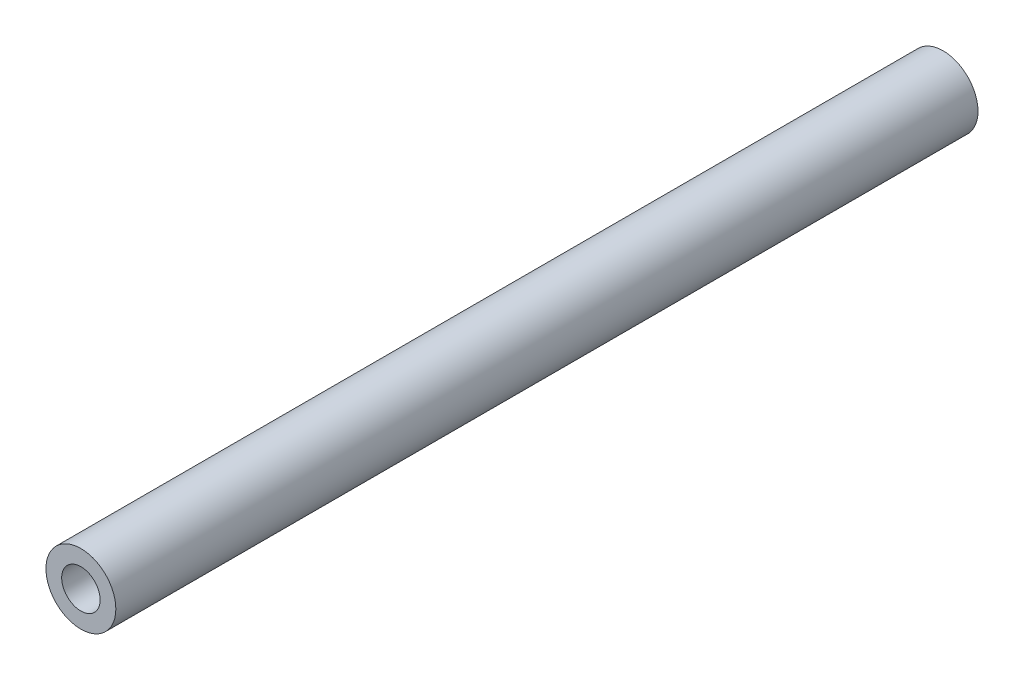
ISO-10303-21;
HEADER;
FILE_DESCRIPTION(('STEP AP214'),'2;1');
FILE_NAME('part.step','',(''),(''),'','','');
FILE_SCHEMA(('AUTOMOTIVE_DESIGN { 1 0 10303 214 1 1 1 1 }'));
ENDSEC;
DATA;
#1=APPLICATION_CONTEXT('core data for automotive mechanical design processes');
#2=APPLICATION_PROTOCOL_DEFINITION('international standard','automotive_design',2000,#1);
#3=PRODUCT_CONTEXT('',#1,'mechanical');
#4=PRODUCT('Part','Part','',(#3));
#5=PRODUCT_RELATED_PRODUCT_CATEGORY('part','',(#4));
#6=PRODUCT_DEFINITION_FORMATION('','',#4);
#7=PRODUCT_DEFINITION_CONTEXT('part definition',#1,'design');
#8=PRODUCT_DEFINITION('design','',#6,#7);
#9=PRODUCT_DEFINITION_SHAPE('','',#8);
#10=(LENGTH_UNIT() NAMED_UNIT(*) SI_UNIT(.MILLI.,.METRE.));
#11=(NAMED_UNIT(*) PLANE_ANGLE_UNIT() SI_UNIT($,.RADIAN.));
#12=(NAMED_UNIT(*) SI_UNIT($,.STERADIAN.) SOLID_ANGLE_UNIT());
#13=UNCERTAINTY_MEASURE_WITH_UNIT(LENGTH_MEASURE(1.E-05),#10,'distance_accuracy_value','');
#14=(GEOMETRIC_REPRESENTATION_CONTEXT(3) GLOBAL_UNCERTAINTY_ASSIGNED_CONTEXT((#13)) GLOBAL_UNIT_ASSIGNED_CONTEXT((#10,
#11,#12)) REPRESENTATION_CONTEXT('',''));
#15=CARTESIAN_POINT('',(0.,0.,0.));
#16=DIRECTION('',(0.,0.,1.));
#17=DIRECTION('',(1.,0.,0.));
#18=AXIS2_PLACEMENT_3D('',#15,#16,#17);
#19=CARTESIAN_POINT('',(0.,0.,74.));
#20=DIRECTION('',(0.,0.,-1.));
#21=DIRECTION('',(-1.,0.,0.));
#22=AXIS2_PLACEMENT_3D('',#19,#20,#21);
#23=CYLINDRICAL_SURFACE('',#22,3.);
#24=CARTESIAN_POINT('',(0.,0.,74.));
#25=DIRECTION('',(0.,0.,1.));
#26=DIRECTION('',(1.,0.,0.));
#27=AXIS2_PLACEMENT_3D('',#24,#25,#26);
#28=CIRCLE('',#27,3.);
#29=CARTESIAN_POINT('',(3.,0.,74.));
#30=VERTEX_POINT('',#29);
#31=EDGE_CURVE('E10',#30,#30,#28,.T.);
#32=ORIENTED_EDGE('',*,*,#31,.F.);
#33=EDGE_LOOP('',(#32));
#34=FACE_BOUND('',#33,.T.);
#35=CARTESIAN_POINT('',(0.,0.,0.));
#36=DIRECTION('',(0.,0.,1.));
#37=DIRECTION('',(1.,0.,0.));
#38=AXIS2_PLACEMENT_3D('',#35,#36,#37);
#39=CIRCLE('',#38,3.);
#40=CARTESIAN_POINT('',(3.,0.,0.));
#41=VERTEX_POINT('',#40);
#42=EDGE_CURVE('E37',#41,#41,#39,.T.);
#43=ORIENTED_EDGE('',*,*,#42,.T.);
#44=EDGE_LOOP('',(#43));
#45=FACE_BOUND('',#44,.T.);
#46=ADVANCED_FACE('F34',(#34,#45),#23,.T.);
#47=CARTESIAN_POINT('',(0.,0.,74.));
#48=DIRECTION('',(0.,0.,1.));
#49=DIRECTION('',(1.,0.,0.));
#50=AXIS2_PLACEMENT_3D('',#47,#48,#49);
#51=PLANE('',#50);
#52=CARTESIAN_POINT('',(0.,0.,74.));
#53=DIRECTION('',(0.,0.,1.));
#54=DIRECTION('',(1.,0.,0.));
#55=AXIS2_PLACEMENT_3D('',#52,#53,#54);
#56=CIRCLE('',#55,1.65);
#57=CARTESIAN_POINT('',(1.65,0.,74.));
#58=VERTEX_POINT('',#57);
#59=EDGE_CURVE('E48',#58,#58,#56,.T.);
#60=ORIENTED_EDGE('',*,*,#59,.F.);
#61=EDGE_LOOP('',(#60));
#62=FACE_BOUND('',#61,.T.);
#63=ORIENTED_EDGE('',*,*,#31,.T.);
#64=EDGE_LOOP('',(#63));
#65=FACE_BOUND('',#64,.T.);
#66=ADVANCED_FACE('F54',(#62,#65),#51,.T.);
#67=CARTESIAN_POINT('',(0.,0.,0.));
#68=DIRECTION('',(0.,0.,1.));
#69=DIRECTION('',(1.,0.,0.));
#70=AXIS2_PLACEMENT_3D('',#67,#68,#69);
#71=PLANE('',#70);
#72=CARTESIAN_POINT('',(0.,0.,0.));
#73=DIRECTION('',(0.,0.,1.));
#74=DIRECTION('',(1.,0.,0.));
#75=AXIS2_PLACEMENT_3D('',#72,#73,#74);
#76=CIRCLE('',#75,1.64999999999999);
#77=CARTESIAN_POINT('',(1.64999999999999,0.,0.));
#78=VERTEX_POINT('',#77);
#79=EDGE_CURVE('E44',#78,#78,#76,.T.);
#80=ORIENTED_EDGE('',*,*,#79,.T.);
#81=EDGE_LOOP('',(#80));
#82=FACE_BOUND('',#81,.T.);
#83=ORIENTED_EDGE('',*,*,#42,.F.);
#84=EDGE_LOOP('',(#83));
#85=FACE_BOUND('',#84,.T.);
#86=ADVANCED_FACE('F56',(#82,#85),#71,.F.);
#87=CARTESIAN_POINT('',(0.,0.,74.));
#88=DIRECTION('',(0.,0.,1.));
#89=DIRECTION('',(1.,0.,0.));
#90=AXIS2_PLACEMENT_3D('',#87,#88,#89);
#91=CYLINDRICAL_SURFACE('',#90,1.64999999999999);
#92=ORIENTED_EDGE('',*,*,#79,.F.);
#93=EDGE_LOOP('',(#92));
#94=FACE_BOUND('',#93,.T.);
#95=ORIENTED_EDGE('',*,*,#59,.T.);
#96=EDGE_LOOP('',(#95));
#97=FACE_BOUND('',#96,.T.);
#98=ADVANCED_FACE('F52',(#94,#97),#91,.F.);
#99=CLOSED_SHELL('',(#46,#66,#86,#98));
#100=MANIFOLD_SOLID_BREP('B2',#99);
#101=ADVANCED_BREP_SHAPE_REPRESENTATION('',(#18,#100),#14);
#102=SHAPE_DEFINITION_REPRESENTATION(#9,#101);
ENDSEC;
END-ISO-10303-21;
